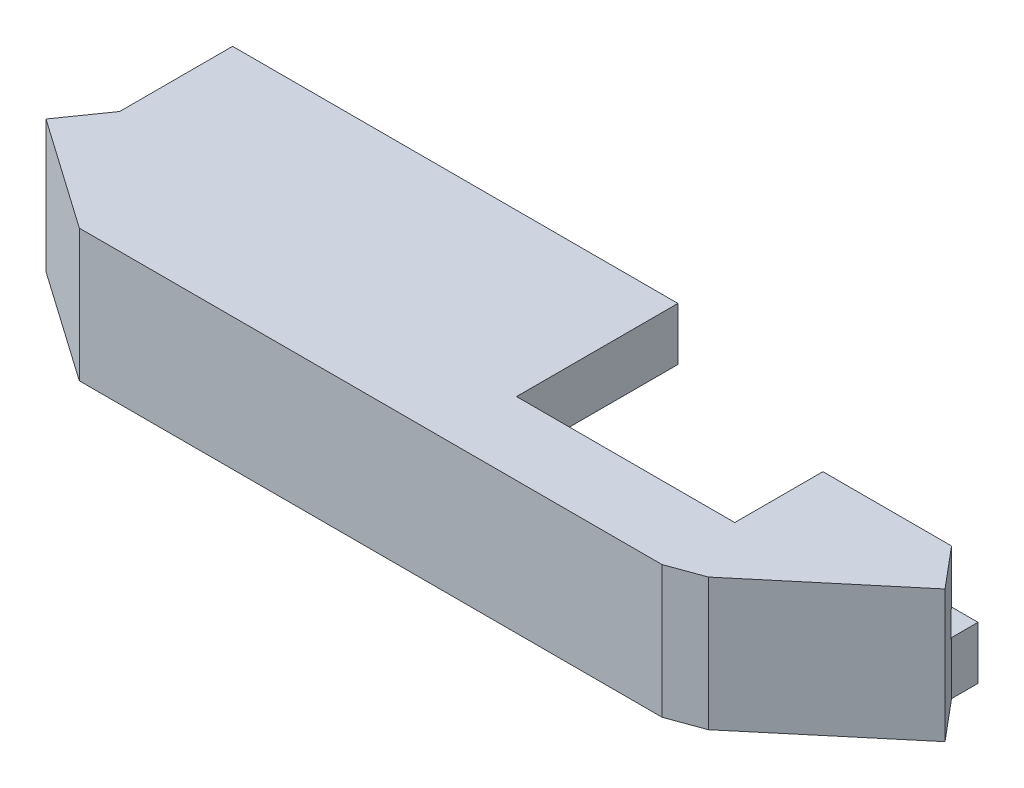
ISO-10303-21;
HEADER;
FILE_DESCRIPTION(('STEP AP214'),'2;1');
FILE_NAME('part.step','',(''),(''),'','','');
FILE_SCHEMA(('AUTOMOTIVE_DESIGN { 1 0 10303 214 1 1 1 1 }'));
ENDSEC;
DATA;
#1=APPLICATION_CONTEXT('core data for automotive mechanical design processes');
#2=APPLICATION_PROTOCOL_DEFINITION('international standard','automotive_design',2000,#1);
#3=PRODUCT_CONTEXT('',#1,'mechanical');
#4=PRODUCT('Part','Part','',(#3));
#5=PRODUCT_RELATED_PRODUCT_CATEGORY('part','',(#4));
#6=PRODUCT_DEFINITION_FORMATION('','',#4);
#7=PRODUCT_DEFINITION_CONTEXT('part definition',#1,'design');
#8=PRODUCT_DEFINITION('design','',#6,#7);
#9=PRODUCT_DEFINITION_SHAPE('','',#8);
#10=(LENGTH_UNIT() NAMED_UNIT(*) SI_UNIT(.MILLI.,.METRE.));
#11=(NAMED_UNIT(*) PLANE_ANGLE_UNIT() SI_UNIT($,.RADIAN.));
#12=(NAMED_UNIT(*) SI_UNIT($,.STERADIAN.) SOLID_ANGLE_UNIT());
#13=UNCERTAINTY_MEASURE_WITH_UNIT(LENGTH_MEASURE(1.E-05),#10,'distance_accuracy_value','');
#14=(GEOMETRIC_REPRESENTATION_CONTEXT(3) GLOBAL_UNCERTAINTY_ASSIGNED_CONTEXT((#13)) GLOBAL_UNIT_ASSIGNED_CONTEXT((#10,
#11,#12)) REPRESENTATION_CONTEXT('',''));
#15=CARTESIAN_POINT('',(0.,0.,0.));
#16=DIRECTION('',(0.,0.,1.));
#17=DIRECTION('',(1.,0.,0.));
#18=AXIS2_PLACEMENT_3D('',#15,#16,#17);
#19=CARTESIAN_POINT('',(0.,-2.,0.));
#20=DIRECTION('',(0.,-1.,0.));
#21=DIRECTION('',(0.,0.,-1.));
#22=AXIS2_PLACEMENT_3D('',#19,#20,#21);
#23=PLANE('',#22);
#24=CARTESIAN_POINT('',(13.15,-2.,0.95));
#25=DIRECTION('',(0.,1.,0.));
#26=DIRECTION('',(0.,0.,1.));
#27=AXIS2_PLACEMENT_3D('',#24,#25,#26);
#28=CIRCLE('',#27,5.15);
#29=CARTESIAN_POINT('',(12.2588159097779,-2.,-4.12230627203593));
#30=VERTEX_POINT('',#29);
#31=CARTESIAN_POINT('',(8.24118409022208,-2.,-0.607570660968924));
#32=VERTEX_POINT('',#31);
#33=EDGE_CURVE('E348',#30,#32,#28,.T.);
#34=ORIENTED_EDGE('',*,*,#33,.F.);
#35=DIRECTION('',(0.,0.,-1.));
#36=VECTOR('',#35,1.);
#37=CARTESIAN_POINT('',(12.2588159097779,-2.,-5.16218792715937));
#38=LINE('',#37,#36);
#39=CARTESIAN_POINT('',(12.2588159097779,-2.,-5.16218792715937));
#40=VERTEX_POINT('',#39);
#41=EDGE_CURVE('E271',#30,#40,#38,.T.);
#42=ORIENTED_EDGE('',*,*,#41,.T.);
#43=DIRECTION('',(1.,0.,0.));
#44=VECTOR('',#43,1.);
#45=CARTESIAN_POINT('',(0.,-2.,-5.16218792715937));
#46=LINE('',#45,#44);
#47=CARTESIAN_POINT('',(-7.37236839860096,-2.,-5.16218792715937));
#48=VERTEX_POINT('',#47);
#49=EDGE_CURVE('E320',#48,#40,#46,.T.);
#50=ORIENTED_EDGE('',*,*,#49,.F.);
#51=DIRECTION('',(-0.573576436351058,0.,0.819152044288984));
#52=VECTOR('',#51,1.);
#53=CARTESIAN_POINT('',(-7.37236839860085,-2.,-5.16218792715952));
#54=LINE('',#53,#52);
#55=CARTESIAN_POINT('',(-7.54444132950627,-2.,-4.91644231387268));
#56=VERTEX_POINT('',#55);
#57=EDGE_CURVE('E318',#48,#56,#54,.T.);
#58=ORIENTED_EDGE('',*,*,#57,.T.);
#59=DIRECTION('',(0.819152044288997,0.,0.573576436351038));
#60=VECTOR('',#59,1.);
#61=CARTESIAN_POINT('',(-0.172072930905292,-2.,0.245745613286671));
#62=LINE('',#61,#60);
#63=CARTESIAN_POINT('',(-0.0945896366636159,-2.,0.300000000000012));
#64=VERTEX_POINT('',#63);
#65=EDGE_CURVE('E356',#56,#64,#62,.T.);
#66=ORIENTED_EDGE('',*,*,#65,.T.);
#67=DIRECTION('',(1.,0.,0.));
#68=VECTOR('',#67,1.);
#69=CARTESIAN_POINT('',(0.,-2.,0.3));
#70=LINE('',#69,#68);
#71=CARTESIAN_POINT('',(8.24118409022208,-2.,0.300000000000003));
#72=VERTEX_POINT('',#71);
#73=EDGE_CURVE('E354',#64,#72,#70,.T.);
#74=ORIENTED_EDGE('',*,*,#73,.T.);
#75=DIRECTION('',(0.,0.,-1.));
#76=VECTOR('',#75,1.);
#77=CARTESIAN_POINT('',(8.24118409022208,-2.,0.));
#78=LINE('',#77,#76);
#79=EDGE_CURVE('E351',#72,#32,#78,.T.);
#80=ORIENTED_EDGE('',*,*,#79,.T.);
#81=EDGE_LOOP('',(#34,#42,#50,#58,#66,#74,#80));
#82=FACE_BOUND('',#81,.T.);
#83=ADVANCED_FACE('F45',(#82),#23,.F.);
#84=CARTESIAN_POINT('',(0.,0.,0.));
#85=DIRECTION('',(0.,1.,0.));
#86=DIRECTION('',(0.,0.,1.));
#87=AXIS2_PLACEMENT_3D('',#84,#85,#86);
#88=PLANE('',#87);
#89=DIRECTION('',(0.819152044288997,0.,0.573576436351038));
#90=VECTOR('',#89,1.);
#91=CARTESIAN_POINT('',(-0.172072930905292,0.,0.245745613286671));
#92=LINE('',#91,#90);
#93=CARTESIAN_POINT('',(-7.54444132950627,0.,-4.91644231387267));
#94=VERTEX_POINT('',#93);
#95=CARTESIAN_POINT('',(-0.0945896366636159,0.,0.300000000000012));
#96=VERTEX_POINT('',#95);
#97=EDGE_CURVE('E368',#94,#96,#92,.T.);
#98=ORIENTED_EDGE('',*,*,#97,.F.);
#99=DIRECTION('',(-0.573576436351033,0.,0.819152044289002));
#100=VECTOR('',#99,1.);
#101=CARTESIAN_POINT('',(-7.37236839860101,0.,-5.16218792715929));
#102=LINE('',#101,#100);
#103=CARTESIAN_POINT('',(-7.37236839860095,0.,-5.16218792715937));
#104=VERTEX_POINT('',#103);
#105=EDGE_CURVE('E402',#104,#94,#102,.T.);
#106=ORIENTED_EDGE('',*,*,#105,.F.);
#107=DIRECTION('',(0.,0.,-1.));
#108=VECTOR('',#107,1.);
#109=CARTESIAN_POINT('',(-7.37236839860096,0.,0.));
#110=LINE('',#109,#108);
#111=CARTESIAN_POINT('',(-7.37236839860095,0.,-13.7));
#112=VERTEX_POINT('',#111);
#113=EDGE_CURVE('E443',#104,#112,#110,.T.);
#114=ORIENTED_EDGE('',*,*,#113,.T.);
#115=DIRECTION('',(-1.,0.,0.));
#116=VECTOR('',#115,1.);
#117=CARTESIAN_POINT('',(0.,0.,-13.7));
#118=LINE('',#117,#116);
#119=CARTESIAN_POINT('',(26.3,0.,-13.7));
#120=VERTEX_POINT('',#119);
#121=EDGE_CURVE('E440',#120,#112,#118,.T.);
#122=ORIENTED_EDGE('',*,*,#121,.F.);
#123=DIRECTION('',(0.,0.,-1.));
#124=VECTOR('',#123,1.);
#125=CARTESIAN_POINT('',(26.3,0.,0.));
#126=LINE('',#125,#124);
#127=CARTESIAN_POINT('',(26.3,0.,-1.5));
#128=VERTEX_POINT('',#127);
#129=EDGE_CURVE('E438',#128,#120,#126,.T.);
#130=ORIENTED_EDGE('',*,*,#129,.F.);
#131=DIRECTION('',(-1.,0.,0.));
#132=VECTOR('',#131,1.);
#133=CARTESIAN_POINT('',(0.,0.,-1.5));
#134=LINE('',#133,#132);
#135=CARTESIAN_POINT('',(42.8,0.,-1.5));
#136=VERTEX_POINT('',#135);
#137=EDGE_CURVE('E436',#136,#128,#134,.T.);
#138=ORIENTED_EDGE('',*,*,#137,.F.);
#139=DIRECTION('',(0.,0.,-1.));
#140=VECTOR('',#139,1.);
#141=CARTESIAN_POINT('',(42.8,0.,0.));
#142=LINE('',#141,#140);
#143=CARTESIAN_POINT('',(42.8,0.,-8.16340264301906));
#144=VERTEX_POINT('',#143);
#145=EDGE_CURVE('E433',#136,#144,#142,.T.);
#146=ORIENTED_EDGE('',*,*,#145,.T.);
#147=DIRECTION('',(-1.,0.,0.));
#148=VECTOR('',#147,1.);
#149=CARTESIAN_POINT('',(0.,0.,-8.16340264301906));
#150=LINE('',#149,#148);
#151=CARTESIAN_POINT('',(52.528764427611,0.,-8.16340264301906));
#152=VERTEX_POINT('',#151);
#153=EDGE_CURVE('E430',#152,#144,#150,.T.);
#154=ORIENTED_EDGE('',*,*,#153,.F.);
#155=DIRECTION('',(0.642787609686541,0.,0.766044443118976));
#156=VECTOR('',#155,1.);
#157=CARTESIAN_POINT('',(34.8448354296832,0.,-29.2382885574803));
#158=LINE('',#157,#156);
#159=CARTESIAN_POINT('',(52.721600710517,0.,-7.93358931008336));
#160=VERTEX_POINT('',#159);
#161=EDGE_CURVE('E379',#152,#160,#158,.T.);
#162=ORIENTED_EDGE('',*,*,#161,.T.);
#163=DIRECTION('',(0.766044443118977,0.,-0.64278760968654));
#164=VECTOR('',#163,1.);
#165=CARTESIAN_POINT('',(17.8767652808337,0.,21.304699247397));
#166=LINE('',#165,#164);
#167=CARTESIAN_POINT('',(42.992836282906,0.,0.22981333293569));
#168=VERTEX_POINT('',#167);
#169=EDGE_CURVE('E370',#168,#160,#166,.T.);
#170=ORIENTED_EDGE('',*,*,#169,.F.);
#171=DIRECTION('',(0.939692620785911,0.,-0.342020143325663));
#172=VECTOR('',#171,1.);
#173=CARTESIAN_POINT('',(5.10306705870667,0.,14.0205615137596));
#174=LINE('',#173,#172);
#175=CARTESIAN_POINT('',(42.8,0.,0.3));
#176=VERTEX_POINT('',#175);
#177=EDGE_CURVE('E373',#176,#168,#174,.T.);
#178=ORIENTED_EDGE('',*,*,#177,.F.);
#179=DIRECTION('',(1.,0.,0.));
#180=VECTOR('',#179,1.);
#181=CARTESIAN_POINT('',(0.,0.,0.3));
#182=LINE('',#181,#180);
#183=CARTESIAN_POINT('',(18.0588159097779,0.,0.3));
#184=VERTEX_POINT('',#183);
#185=EDGE_CURVE('E349',#184,#176,#182,.T.);
#186=ORIENTED_EDGE('',*,*,#185,.F.);
#187=DIRECTION('',(0.,0.,-1.));
#188=VECTOR('',#187,1.);
#189=CARTESIAN_POINT('',(18.0588159097779,0.,0.));
#190=LINE('',#189,#188);
#191=CARTESIAN_POINT('',(18.0588159097779,0.,-0.607570660968912));
#192=VERTEX_POINT('',#191);
#193=EDGE_CURVE('E345',#184,#192,#190,.T.);
#194=ORIENTED_EDGE('',*,*,#193,.T.);
#195=CARTESIAN_POINT('',(13.15,0.,0.95));
#196=DIRECTION('',(0.,1.,0.));
#197=DIRECTION('',(0.,0.,1.));
#198=AXIS2_PLACEMENT_3D('',#195,#196,#197);
#199=CIRCLE('',#198,5.15);
#200=CARTESIAN_POINT('',(8.24118409022208,0.,-0.607570660968924));
#201=VERTEX_POINT('',#200);
#202=EDGE_CURVE('E249',#192,#201,#199,.T.);
#203=ORIENTED_EDGE('',*,*,#202,.T.);
#204=DIRECTION('',(0.,0.,-1.));
#205=VECTOR('',#204,1.);
#206=CARTESIAN_POINT('',(8.24118409022208,0.,0.));
#207=LINE('',#206,#205);
#208=CARTESIAN_POINT('',(8.24118409022208,0.,0.300000000000003));
#209=VERTEX_POINT('',#208);
#210=EDGE_CURVE('E364',#209,#201,#207,.T.);
#211=ORIENTED_EDGE('',*,*,#210,.F.);
#212=EDGE_CURVE('E68',#96,#209,#182,.T.);
#213=ORIENTED_EDGE('',*,*,#212,.F.);
#214=EDGE_LOOP('',(#98,#106,#114,#122,#130,#138,#146,#154,#162,#170,#178,#186,#194,#203,#211,#213));
#215=FACE_BOUND('',#214,.T.);
#216=ADVANCED_FACE('F476',(#215),#88,.F.);
#217=CARTESIAN_POINT('',(20.2550794366737,4.,24.1390636869372));
#218=DIRECTION('',(-0.642787609686537,0.,-0.76604444311898));
#219=DIRECTION('',(-0.76604444311898,0.,0.642787609686537));
#220=AXIS2_PLACEMENT_3D('',#217,#218,#219);
#221=PLANE('',#220);
#222=DIRECTION('',(0.,-1.,0.));
#223=VECTOR('',#222,1.);
#224=CARTESIAN_POINT('',(45.3711504387462,4.,3.06417777247591));
#225=LINE('',#224,#223);
#226=CARTESIAN_POINT('',(45.3711504387462,4.,3.06417777247591));
#227=VERTEX_POINT('',#226);
#228=CARTESIAN_POINT('',(45.3711504387462,-6.,3.06417777247592));
#229=VERTEX_POINT('',#228);
#230=EDGE_CURVE('E428',#227,#229,#225,.T.);
#231=ORIENTED_EDGE('',*,*,#230,.T.);
#232=DIRECTION('',(0.76604444311898,0.,-0.642787609686537));
#233=VECTOR('',#232,1.);
#234=CARTESIAN_POINT('',(20.2550794366737,-6.,24.1390636869372));
#235=LINE('',#234,#233);
#236=CARTESIAN_POINT('',(55.0999148663572,-6.,-5.0992248705431));
#237=VERTEX_POINT('',#236);
#238=EDGE_CURVE('E286',#229,#237,#235,.T.);
#239=ORIENTED_EDGE('',*,*,#238,.T.);
#240=DIRECTION('',(0.,-1.,0.));
#241=VECTOR('',#240,1.);
#242=CARTESIAN_POINT('',(55.0999148663572,4.,-5.0992248705431));
#243=LINE('',#242,#241);
#244=CARTESIAN_POINT('',(55.0999148663572,4.,-5.0992248705431));
#245=VERTEX_POINT('',#244);
#246=EDGE_CURVE('E11',#245,#237,#243,.T.);
#247=ORIENTED_EDGE('',*,*,#246,.F.);
#248=DIRECTION('',(0.76604444311898,0.,-0.642787609686537));
#249=VECTOR('',#248,1.);
#250=CARTESIAN_POINT('',(20.2550794366737,4.,24.1390636869372));
#251=LINE('',#250,#249);
#252=EDGE_CURVE('E399',#227,#245,#251,.T.);
#253=ORIENTED_EDGE('',*,*,#252,.F.);
#254=EDGE_LOOP('',(#231,#239,#247,#253));
#255=FACE_BOUND('',#254,.T.);
#256=ADVANCED_FACE('F47',(#255),#221,.F.);
#257=CARTESIAN_POINT('',(34.8448354296832,4.,-29.2382885574803));
#258=DIRECTION('',(0.766044443118976,0.,-0.642787609686541));
#259=DIRECTION('',(-0.642787609686541,0.,-0.766044443118976));
#260=AXIS2_PLACEMENT_3D('',#257,#258,#259);
#261=PLANE('',#260);
#262=ORIENTED_EDGE('',*,*,#161,.F.);
#263=DIRECTION('',(0.,-1.,0.));
#264=VECTOR('',#263,1.);
#265=CARTESIAN_POINT('',(52.528764427611,4.,-8.16340264301906));
#266=LINE('',#265,#264);
#267=CARTESIAN_POINT('',(52.528764427611,4.,-8.16340264301906));
#268=VERTEX_POINT('',#267);
#269=EDGE_CURVE('E53',#268,#152,#266,.T.);
#270=ORIENTED_EDGE('',*,*,#269,.F.);
#271=DIRECTION('',(0.642787609686541,0.,0.766044443118976));
#272=VECTOR('',#271,1.);
#273=CARTESIAN_POINT('',(34.8448354296832,4.,-29.2382885574803));
#274=LINE('',#273,#272);
#275=EDGE_CURVE('E401',#268,#245,#274,.T.);
#276=ORIENTED_EDGE('',*,*,#275,.T.);
#277=ORIENTED_EDGE('',*,*,#246,.T.);
#278=DIRECTION('',(0.642787609686538,0.,0.76604444311898));
#279=VECTOR('',#278,1.);
#280=CARTESIAN_POINT('',(34.8448354296835,-6.,-29.2382885574803));
#281=LINE('',#280,#279);
#282=CARTESIAN_POINT('',(52.528764427611,-6.,-8.16340264301906));
#283=VERTEX_POINT('',#282);
#284=EDGE_CURVE('E282',#283,#237,#281,.T.);
#285=ORIENTED_EDGE('',*,*,#284,.F.);
#286=DIRECTION('',(0.,1.,0.));
#287=VECTOR('',#286,1.);
#288=CARTESIAN_POINT('',(52.528764427611,-6.,-8.16340264301906));
#289=LINE('',#288,#287);
#290=CARTESIAN_POINT('',(52.528764427611,-2.,-8.16340264301906));
#291=VERTEX_POINT('',#290);
#292=EDGE_CURVE('E343',#283,#291,#289,.T.);
#293=ORIENTED_EDGE('',*,*,#292,.T.);
#294=DIRECTION('',(0.642787609686538,0.,0.76604444311898));
#295=VECTOR('',#294,1.);
#296=CARTESIAN_POINT('',(34.8448354296835,-2.,-29.2382885574803));
#297=LINE('',#296,#295);
#298=CARTESIAN_POINT('',(52.721600710517,-2.,-7.93358931008337));
#299=VERTEX_POINT('',#298);
#300=EDGE_CURVE('E315',#291,#299,#297,.T.);
#301=ORIENTED_EDGE('',*,*,#300,.T.);
#302=DIRECTION('',(0.,1.,0.));
#303=VECTOR('',#302,1.);
#304=CARTESIAN_POINT('',(52.721600710517,-2.,-7.93358931008336));
#305=LINE('',#304,#303);
#306=EDGE_CURVE('E386',#299,#160,#305,.T.);
#307=ORIENTED_EDGE('',*,*,#306,.T.);
#308=EDGE_LOOP('',(#262,#270,#276,#277,#285,#293,#301,#307));
#309=FACE_BOUND('',#308,.T.);
#310=ADVANCED_FACE('F479',(#309),#261,.T.);
#311=CARTESIAN_POINT('',(0.,4.,-8.16340264301906));
#312=DIRECTION('',(0.,0.,1.));
#313=DIRECTION('',(1.,0.,0.));
#314=AXIS2_PLACEMENT_3D('',#311,#312,#313);
#315=PLANE('',#314);
#316=ORIENTED_EDGE('',*,*,#153,.T.);
#317=DIRECTION('',(0.,-1.,0.));
#318=VECTOR('',#317,1.);
#319=CARTESIAN_POINT('',(42.8,4.,-8.16340264301906));
#320=LINE('',#319,#318);
#321=CARTESIAN_POINT('',(42.8,4.,-8.16340264301906));
#322=VERTEX_POINT('',#321);
#323=EDGE_CURVE('E467',#322,#144,#320,.T.);
#324=ORIENTED_EDGE('',*,*,#323,.F.);
#325=DIRECTION('',(-1.,0.,0.));
#326=VECTOR('',#325,1.);
#327=CARTESIAN_POINT('',(0.,4.,-8.16340264301906));
#328=LINE('',#327,#326);
#329=EDGE_CURVE('E405',#268,#322,#328,.T.);
#330=ORIENTED_EDGE('',*,*,#329,.F.);
#331=ORIENTED_EDGE('',*,*,#269,.T.);
#332=EDGE_LOOP('',(#316,#324,#330,#331));
#333=FACE_BOUND('',#332,.T.);
#334=ADVANCED_FACE('F471',(#333),#315,.F.);
#335=CARTESIAN_POINT('',(42.8,4.,0.));
#336=DIRECTION('',(-1.,0.,0.));
#337=DIRECTION('',(0.,0.,1.));
#338=AXIS2_PLACEMENT_3D('',#335,#336,#337);
#339=PLANE('',#338);
#340=ORIENTED_EDGE('',*,*,#145,.F.);
#341=DIRECTION('',(0.,-1.,0.));
#342=VECTOR('',#341,1.);
#343=CARTESIAN_POINT('',(42.8,4.,-1.5));
#344=LINE('',#343,#342);
#345=CARTESIAN_POINT('',(42.8,4.,-1.5));
#346=VERTEX_POINT('',#345);
#347=EDGE_CURVE('E465',#346,#136,#344,.T.);
#348=ORIENTED_EDGE('',*,*,#347,.F.);
#349=DIRECTION('',(0.,0.,-1.));
#350=VECTOR('',#349,1.);
#351=CARTESIAN_POINT('',(42.8,4.,0.));
#352=LINE('',#351,#350);
#353=EDGE_CURVE('E407',#346,#322,#352,.T.);
#354=ORIENTED_EDGE('',*,*,#353,.T.);
#355=ORIENTED_EDGE('',*,*,#323,.T.);
#356=EDGE_LOOP('',(#340,#348,#354,#355));
#357=FACE_BOUND('',#356,.T.);
#358=ADVANCED_FACE('F581',(#357),#339,.T.);
#359=CARTESIAN_POINT('',(0.,4.,-1.5));
#360=DIRECTION('',(0.,0.,1.));
#361=DIRECTION('',(1.,0.,0.));
#362=AXIS2_PLACEMENT_3D('',#359,#360,#361);
#363=PLANE('',#362);
#364=ORIENTED_EDGE('',*,*,#137,.T.);
#365=DIRECTION('',(0.,-1.,0.));
#366=VECTOR('',#365,1.);
#367=CARTESIAN_POINT('',(26.3,4.,-1.5));
#368=LINE('',#367,#366);
#369=CARTESIAN_POINT('',(26.3,4.,-1.5));
#370=VERTEX_POINT('',#369);
#371=EDGE_CURVE('E462',#370,#128,#368,.T.);
#372=ORIENTED_EDGE('',*,*,#371,.F.);
#373=DIRECTION('',(-1.,0.,0.));
#374=VECTOR('',#373,1.);
#375=CARTESIAN_POINT('',(0.,4.,-1.5));
#376=LINE('',#375,#374);
#377=EDGE_CURVE('E410',#346,#370,#376,.T.);
#378=ORIENTED_EDGE('',*,*,#377,.F.);
#379=ORIENTED_EDGE('',*,*,#347,.T.);
#380=EDGE_LOOP('',(#364,#372,#378,#379));
#381=FACE_BOUND('',#380,.T.);
#382=ADVANCED_FACE('F578',(#381),#363,.F.);
#383=CARTESIAN_POINT('',(26.3,4.,0.));
#384=DIRECTION('',(-1.,0.,0.));
#385=DIRECTION('',(0.,0.,1.));
#386=AXIS2_PLACEMENT_3D('',#383,#384,#385);
#387=PLANE('',#386);
#388=ORIENTED_EDGE('',*,*,#129,.T.);
#389=DIRECTION('',(0.,-1.,0.));
#390=VECTOR('',#389,1.);
#391=CARTESIAN_POINT('',(26.3,4.,-13.7));
#392=LINE('',#391,#390);
#393=CARTESIAN_POINT('',(26.3,4.,-13.7));
#394=VERTEX_POINT('',#393);
#395=EDGE_CURVE('E459',#394,#120,#392,.T.);
#396=ORIENTED_EDGE('',*,*,#395,.F.);
#397=DIRECTION('',(0.,0.,-1.));
#398=VECTOR('',#397,1.);
#399=CARTESIAN_POINT('',(26.3,4.,0.));
#400=LINE('',#399,#398);
#401=EDGE_CURVE('E412',#370,#394,#400,.T.);
#402=ORIENTED_EDGE('',*,*,#401,.F.);
#403=ORIENTED_EDGE('',*,*,#371,.T.);
#404=EDGE_LOOP('',(#388,#396,#402,#403));
#405=FACE_BOUND('',#404,.T.);
#406=ADVANCED_FACE('F574',(#405),#387,.F.);
#407=CARTESIAN_POINT('',(0.,4.,-13.7));
#408=DIRECTION('',(0.,0.,1.));
#409=DIRECTION('',(1.,0.,0.));
#410=AXIS2_PLACEMENT_3D('',#407,#408,#409);
#411=PLANE('',#410);
#412=ORIENTED_EDGE('',*,*,#121,.T.);
#413=DIRECTION('',(0.,-1.,0.));
#414=VECTOR('',#413,1.);
#415=CARTESIAN_POINT('',(-7.37236839860095,4.,-13.7));
#416=LINE('',#415,#414);
#417=CARTESIAN_POINT('',(-7.37236839860095,4.,-13.7));
#418=VERTEX_POINT('',#417);
#419=EDGE_CURVE('E457',#418,#112,#416,.T.);
#420=ORIENTED_EDGE('',*,*,#419,.F.);
#421=DIRECTION('',(-1.,0.,0.));
#422=VECTOR('',#421,1.);
#423=CARTESIAN_POINT('',(0.,4.,-13.7));
#424=LINE('',#423,#422);
#425=EDGE_CURVE('E414',#394,#418,#424,.T.);
#426=ORIENTED_EDGE('',*,*,#425,.F.);
#427=ORIENTED_EDGE('',*,*,#395,.T.);
#428=EDGE_LOOP('',(#412,#420,#426,#427));
#429=FACE_BOUND('',#428,.T.);
#430=ADVANCED_FACE('F569',(#429),#411,.F.);
#431=CARTESIAN_POINT('',(-7.37236839860096,4.,0.));
#432=DIRECTION('',(-1.,0.,0.));
#433=DIRECTION('',(0.,0.,1.));
#434=AXIS2_PLACEMENT_3D('',#431,#432,#433);
#435=PLANE('',#434);
#436=ORIENTED_EDGE('',*,*,#113,.F.);
#437=DIRECTION('',(0.,-1.,0.));
#438=VECTOR('',#437,1.);
#439=CARTESIAN_POINT('',(-7.37236839860095,4.,-5.16218792715937));
#440=LINE('',#439,#438);
#441=CARTESIAN_POINT('',(-7.37236839860095,4.,-5.16218792715937));
#442=VERTEX_POINT('',#441);
#443=EDGE_CURVE('E455',#442,#104,#440,.T.);
#444=ORIENTED_EDGE('',*,*,#443,.F.);
#445=DIRECTION('',(0.,0.,-1.));
#446=VECTOR('',#445,1.);
#447=CARTESIAN_POINT('',(-7.37236839860096,4.,0.));
#448=LINE('',#447,#446);
#449=EDGE_CURVE('E416',#442,#418,#448,.T.);
#450=ORIENTED_EDGE('',*,*,#449,.T.);
#451=ORIENTED_EDGE('',*,*,#419,.T.);
#452=EDGE_LOOP('',(#436,#444,#450,#451));
#453=FACE_BOUND('',#452,.T.);
#454=ADVANCED_FACE('F564',(#453),#435,.T.);
#455=CARTESIAN_POINT('',(-7.37236839860101,4.,-5.16218792715929));
#456=DIRECTION('',(0.819152044289001,0.,0.573576436351032));
#457=DIRECTION('',(0.573576436351032,0.,-0.819152044289002));
#458=AXIS2_PLACEMENT_3D('',#455,#456,#457);
#459=PLANE('',#458);
#460=ORIENTED_EDGE('',*,*,#105,.T.);
#461=DIRECTION('',(0.,1.,0.));
#462=VECTOR('',#461,1.);
#463=CARTESIAN_POINT('',(-7.54444132950626,-2.,-4.91644231387267));
#464=LINE('',#463,#462);
#465=EDGE_CURVE('E389',#56,#94,#464,.T.);
#466=ORIENTED_EDGE('',*,*,#465,.F.);
#467=ORIENTED_EDGE('',*,*,#57,.F.);
#468=DIRECTION('',(0.,1.,0.));
#469=VECTOR('',#468,1.);
#470=CARTESIAN_POINT('',(-7.37236839860096,-6.,-5.16218792715937));
#471=LINE('',#470,#469);
#472=CARTESIAN_POINT('',(-7.37236839860096,-6.,-5.16218792715937));
#473=VERTEX_POINT('',#472);
#474=EDGE_CURVE('E341',#473,#48,#471,.T.);
#475=ORIENTED_EDGE('',*,*,#474,.F.);
#476=DIRECTION('',(-0.573576436351058,0.,0.819152044288984));
#477=VECTOR('',#476,1.);
#478=CARTESIAN_POINT('',(-7.37236839860085,-6.,-5.16218792715952));
#479=LINE('',#478,#477);
#480=CARTESIAN_POINT('',(-9.66667414400513,-6.,-1.88557975000338));
#481=VERTEX_POINT('',#480);
#482=EDGE_CURVE('E298',#473,#481,#479,.T.);
#483=ORIENTED_EDGE('',*,*,#482,.T.);
#484=DIRECTION('',(0.,-1.,0.));
#485=VECTOR('',#484,1.);
#486=CARTESIAN_POINT('',(-9.66667414400511,4.,-1.88557975000338));
#487=LINE('',#486,#485);
#488=CARTESIAN_POINT('',(-9.66667414400511,4.,-1.88557975000338));
#489=VERTEX_POINT('',#488);
#490=EDGE_CURVE('E453',#489,#481,#487,.T.);
#491=ORIENTED_EDGE('',*,*,#490,.F.);
#492=DIRECTION('',(-0.573576436351033,0.,0.819152044289002));
#493=VECTOR('',#492,1.);
#494=CARTESIAN_POINT('',(-7.37236839860101,4.,-5.16218792715929));
#495=LINE('',#494,#493);
#496=EDGE_CURVE('E419',#442,#489,#495,.T.);
#497=ORIENTED_EDGE('',*,*,#496,.F.);
#498=ORIENTED_EDGE('',*,*,#443,.T.);
#499=EDGE_LOOP('',(#460,#466,#467,#475,#483,#491,#497,#498));
#500=FACE_BOUND('',#499,.T.);
#501=ADVANCED_FACE('F537',(#500),#459,.F.);
#502=CARTESIAN_POINT('',(-2.29430574540413,4.,3.27660817715596));
#503=DIRECTION('',(0.573576436351038,0.,-0.819152044288997));
#504=DIRECTION('',(-0.819152044288997,0.,-0.573576436351038));
#505=AXIS2_PLACEMENT_3D('',#502,#503,#504);
#506=PLANE('',#505);
#507=ORIENTED_EDGE('',*,*,#490,.T.);
#508=DIRECTION('',(0.819152044288997,0.,0.573576436351038));
#509=VECTOR('',#508,1.);
#510=CARTESIAN_POINT('',(-2.29430574540414,-6.,3.27660817715597));
#511=LINE('',#510,#509);
#512=CARTESIAN_POINT('',(-1.26119515551587,-6.,4.));
#513=VERTEX_POINT('',#512);
#514=EDGE_CURVE('E295',#481,#513,#511,.T.);
#515=ORIENTED_EDGE('',*,*,#514,.T.);
#516=DIRECTION('',(0.,-1.,0.));
#517=VECTOR('',#516,1.);
#518=CARTESIAN_POINT('',(-1.26119515551585,4.,4.));
#519=LINE('',#518,#517);
#520=CARTESIAN_POINT('',(-1.26119515551585,4.,4.));
#521=VERTEX_POINT('',#520);
#522=EDGE_CURVE('E451',#521,#513,#519,.T.);
#523=ORIENTED_EDGE('',*,*,#522,.F.);
#524=DIRECTION('',(0.819152044288997,0.,0.573576436351038));
#525=VECTOR('',#524,1.);
#526=CARTESIAN_POINT('',(-2.29430574540413,4.,3.27660817715596));
#527=LINE('',#526,#525);
#528=EDGE_CURVE('E421',#489,#521,#527,.T.);
#529=ORIENTED_EDGE('',*,*,#528,.F.);
#530=EDGE_LOOP('',(#507,#515,#523,#529));
#531=FACE_BOUND('',#530,.T.);
#532=ADVANCED_FACE('F532',(#531),#506,.F.);
#533=CARTESIAN_POINT('',(0.,4.,4.));
#534=DIRECTION('',(0.,0.,1.));
#535=DIRECTION('',(1.,0.,0.));
#536=AXIS2_PLACEMENT_3D('',#533,#534,#535);
#537=PLANE('',#536);
#538=ORIENTED_EDGE('',*,*,#522,.T.);
#539=DIRECTION('',(-1.,0.,0.));
#540=VECTOR('',#539,1.);
#541=CARTESIAN_POINT('',(0.,-6.,4.));
#542=LINE('',#541,#540);
#543=CARTESIAN_POINT('',(42.8,-6.,4.));
#544=VERTEX_POINT('',#543);
#545=EDGE_CURVE('E292',#544,#513,#542,.T.);
#546=ORIENTED_EDGE('',*,*,#545,.F.);
#547=DIRECTION('',(0.,-1.,0.));
#548=VECTOR('',#547,1.);
#549=CARTESIAN_POINT('',(42.8,4.,4.));
#550=LINE('',#549,#548);
#551=CARTESIAN_POINT('',(42.8,4.,4.));
#552=VERTEX_POINT('',#551);
#553=EDGE_CURVE('E449',#552,#544,#550,.T.);
#554=ORIENTED_EDGE('',*,*,#553,.F.);
#555=DIRECTION('',(-1.,0.,0.));
#556=VECTOR('',#555,1.);
#557=CARTESIAN_POINT('',(0.,4.,4.));
#558=LINE('',#557,#556);
#559=EDGE_CURVE('E423',#552,#521,#558,.T.);
#560=ORIENTED_EDGE('',*,*,#559,.T.);
#561=EDGE_LOOP('',(#538,#546,#554,#560));
#562=FACE_BOUND('',#561,.T.);
#563=ADVANCED_FACE('F584',(#562),#537,.T.);
#564=CARTESIAN_POINT('',(6.29222413662691,4.,17.2877437335299));
#565=DIRECTION('',(-0.342020143325668,0.,-0.939692620785909));
#566=DIRECTION('',(-0.939692620785909,0.,0.342020143325668));
#567=AXIS2_PLACEMENT_3D('',#564,#565,#566);
#568=PLANE('',#567);
#569=ORIENTED_EDGE('',*,*,#553,.T.);
#570=DIRECTION('',(0.939692620785909,0.,-0.342020143325667));
#571=VECTOR('',#570,1.);
#572=CARTESIAN_POINT('',(6.2922241366269,-6.,17.2877437335299));
#573=LINE('',#572,#571);
#574=EDGE_CURVE('E289',#544,#229,#573,.T.);
#575=ORIENTED_EDGE('',*,*,#574,.T.);
#576=ORIENTED_EDGE('',*,*,#230,.F.);
#577=DIRECTION('',(0.939692620785909,0.,-0.342020143325668));
#578=VECTOR('',#577,1.);
#579=CARTESIAN_POINT('',(6.29222413662691,4.,17.2877437335299));
#580=LINE('',#579,#578);
#581=EDGE_CURVE('E426',#552,#227,#580,.T.);
#582=ORIENTED_EDGE('',*,*,#581,.F.);
#583=EDGE_LOOP('',(#569,#575,#576,#582));
#584=FACE_BOUND('',#583,.T.);
#585=ADVANCED_FACE('F524',(#584),#568,.F.);
#586=CARTESIAN_POINT('',(0.,4.,0.));
#587=DIRECTION('',(0.,1.,0.));
#588=DIRECTION('',(0.,0.,1.));
#589=AXIS2_PLACEMENT_3D('',#586,#587,#588);
#590=PLANE('',#589);
#591=ORIENTED_EDGE('',*,*,#252,.T.);
#592=ORIENTED_EDGE('',*,*,#275,.F.);
#593=ORIENTED_EDGE('',*,*,#329,.T.);
#594=ORIENTED_EDGE('',*,*,#353,.F.);
#595=ORIENTED_EDGE('',*,*,#377,.T.);
#596=ORIENTED_EDGE('',*,*,#401,.T.);
#597=ORIENTED_EDGE('',*,*,#425,.T.);
#598=ORIENTED_EDGE('',*,*,#449,.F.);
#599=ORIENTED_EDGE('',*,*,#496,.T.);
#600=ORIENTED_EDGE('',*,*,#528,.T.);
#601=ORIENTED_EDGE('',*,*,#559,.F.);
#602=ORIENTED_EDGE('',*,*,#581,.T.);
#603=EDGE_LOOP('',(#591,#592,#593,#594,#595,#596,#597,#598,#599,#600,#601,#602));
#604=FACE_BOUND('',#603,.T.);
#605=ADVANCED_FACE('F583',(#604),#590,.T.);
#606=CARTESIAN_POINT('',(18.0588159097779,-2.,0.));
#607=DIRECTION('',(1.,0.,0.));
#608=DIRECTION('',(0.,0.,-1.));
#609=AXIS2_PLACEMENT_3D('',#606,#607,#608);
#610=PLANE('',#609);
#611=ORIENTED_EDGE('',*,*,#193,.F.);
#612=DIRECTION('',(0.,1.,0.));
#613=VECTOR('',#612,1.);
#614=CARTESIAN_POINT('',(18.0588159097779,-2.,0.3));
#615=LINE('',#614,#613);
#616=CARTESIAN_POINT('',(18.0588159097779,-2.,0.3));
#617=VERTEX_POINT('',#616);
#618=EDGE_CURVE('E376',#617,#184,#615,.T.);
#619=ORIENTED_EDGE('',*,*,#618,.F.);
#620=DIRECTION('',(0.,0.,-1.));
#621=VECTOR('',#620,1.);
#622=CARTESIAN_POINT('',(18.0588159097779,-2.,0.));
#623=LINE('',#622,#621);
#624=CARTESIAN_POINT('',(18.0588159097779,-2.,0.));
#625=VERTEX_POINT('',#624);
#626=EDGE_CURVE('E346',#617,#625,#623,.T.);
#627=ORIENTED_EDGE('',*,*,#626,.T.);
#628=DIRECTION('',(0.,-1.,0.));
#629=VECTOR('',#628,1.);
#630=CARTESIAN_POINT('',(18.0588159097779,-2.,0.));
#631=LINE('',#630,#629);
#632=CARTESIAN_POINT('',(18.0588159097779,-6.,0.));
#633=VERTEX_POINT('',#632);
#634=EDGE_CURVE('E259',#625,#633,#631,.T.);
#635=ORIENTED_EDGE('',*,*,#634,.T.);
#636=DIRECTION('',(0.,0.,1.));
#637=VECTOR('',#636,1.);
#638=CARTESIAN_POINT('',(18.0588159097779,-6.,0.));
#639=LINE('',#638,#637);
#640=CARTESIAN_POINT('',(18.0588159097779,-6.,-0.607570660968916));
#641=VERTEX_POINT('',#640);
#642=EDGE_CURVE('E256',#641,#633,#639,.T.);
#643=ORIENTED_EDGE('',*,*,#642,.F.);
#644=DIRECTION('',(0.,1.,0.));
#645=VECTOR('',#644,1.);
#646=CARTESIAN_POINT('',(18.0588159097779,-2.,-0.607570660968912));
#647=LINE('',#646,#645);
#648=EDGE_CURVE('E242',#641,#192,#647,.T.);
#649=ORIENTED_EDGE('',*,*,#648,.T.);
#650=EDGE_LOOP('',(#611,#619,#627,#635,#643,#649));
#651=FACE_BOUND('',#650,.T.);
#652=ADVANCED_FACE('F257',(#651),#610,.T.);
#653=CARTESIAN_POINT('',(0.,-2.,0.3));
#654=DIRECTION('',(0.,0.,1.));
#655=DIRECTION('',(1.,0.,0.));
#656=AXIS2_PLACEMENT_3D('',#653,#654,#655);
#657=PLANE('',#656);
#658=ORIENTED_EDGE('',*,*,#185,.T.);
#659=DIRECTION('',(0.,1.,0.));
#660=VECTOR('',#659,1.);
#661=CARTESIAN_POINT('',(42.8,-2.,0.3));
#662=LINE('',#661,#660);
#663=CARTESIAN_POINT('',(42.8,-2.,0.3));
#664=VERTEX_POINT('',#663);
#665=EDGE_CURVE('E380',#664,#176,#662,.T.);
#666=ORIENTED_EDGE('',*,*,#665,.F.);
#667=EDGE_CURVE('E253',#617,#664,#70,.T.);
#668=ORIENTED_EDGE('',*,*,#667,.F.);
#669=ORIENTED_EDGE('',*,*,#618,.T.);
#670=EDGE_LOOP('',(#658,#666,#668,#669));
#671=FACE_BOUND('',#670,.T.);
#672=ADVANCED_FACE('F493',(#671),#657,.F.);
#673=CARTESIAN_POINT('',(5.10306705870667,-2.,14.0205615137596));
#674=DIRECTION('',(0.342020143325663,0.,0.939692620785911));
#675=DIRECTION('',(0.939692620785911,0.,-0.342020143325663));
#676=AXIS2_PLACEMENT_3D('',#673,#674,#675);
#677=PLANE('',#676);
#678=ORIENTED_EDGE('',*,*,#177,.T.);
#679=DIRECTION('',(0.,1.,0.));
#680=VECTOR('',#679,1.);
#681=CARTESIAN_POINT('',(42.992836282906,-2.,0.22981333293569));
#682=LINE('',#681,#680);
#683=CARTESIAN_POINT('',(42.992836282906,-2.,0.22981333293569));
#684=VERTEX_POINT('',#683);
#685=EDGE_CURVE('E383',#684,#168,#682,.T.);
#686=ORIENTED_EDGE('',*,*,#685,.F.);
#687=DIRECTION('',(0.939692620785911,0.,-0.342020143325663));
#688=VECTOR('',#687,1.);
#689=CARTESIAN_POINT('',(5.10306705870667,-2.,14.0205615137596));
#690=LINE('',#689,#688);
#691=EDGE_CURVE('E360',#664,#684,#690,.T.);
#692=ORIENTED_EDGE('',*,*,#691,.F.);
#693=ORIENTED_EDGE('',*,*,#665,.T.);
#694=EDGE_LOOP('',(#678,#686,#692,#693));
#695=FACE_BOUND('',#694,.T.);
#696=ADVANCED_FACE('F488',(#695),#677,.F.);
#697=CARTESIAN_POINT('',(17.8767652808337,-2.,21.304699247397));
#698=DIRECTION('',(0.64278760968654,0.,0.766044443118977));
#699=DIRECTION('',(0.766044443118977,0.,-0.64278760968654));
#700=AXIS2_PLACEMENT_3D('',#697,#698,#699);
#701=PLANE('',#700);
#702=ORIENTED_EDGE('',*,*,#169,.T.);
#703=ORIENTED_EDGE('',*,*,#306,.F.);
#704=DIRECTION('',(0.766044443118977,0.,-0.64278760968654));
#705=VECTOR('',#704,1.);
#706=CARTESIAN_POINT('',(17.8767652808337,-2.,21.304699247397));
#707=LINE('',#706,#705);
#708=EDGE_CURVE('E358',#684,#299,#707,.T.);
#709=ORIENTED_EDGE('',*,*,#708,.F.);
#710=ORIENTED_EDGE('',*,*,#685,.T.);
#711=EDGE_LOOP('',(#702,#703,#709,#710));
#712=FACE_BOUND('',#711,.T.);
#713=ADVANCED_FACE('F484',(#712),#701,.F.);
#714=CARTESIAN_POINT('',(-0.172072930905292,-2.,0.245745613286671));
#715=DIRECTION('',(-0.573576436351038,0.,0.819152044288997));
#716=DIRECTION('',(0.819152044288997,0.,0.573576436351038));
#717=AXIS2_PLACEMENT_3D('',#714,#715,#716);
#718=PLANE('',#717);
#719=ORIENTED_EDGE('',*,*,#97,.T.);
#720=DIRECTION('',(0.,1.,0.));
#721=VECTOR('',#720,1.);
#722=CARTESIAN_POINT('',(-0.0945896366636159,-2.,0.300000000000012));
#723=LINE('',#722,#721);
#724=EDGE_CURVE('E392',#64,#96,#723,.T.);
#725=ORIENTED_EDGE('',*,*,#724,.F.);
#726=ORIENTED_EDGE('',*,*,#65,.F.);
#727=ORIENTED_EDGE('',*,*,#465,.T.);
#728=EDGE_LOOP('',(#719,#725,#726,#727));
#729=FACE_BOUND('',#728,.T.);
#730=ADVANCED_FACE('F559',(#729),#718,.F.);
#731=ORIENTED_EDGE('',*,*,#212,.T.);
#732=DIRECTION('',(0.,1.,0.));
#733=VECTOR('',#732,1.);
#734=CARTESIAN_POINT('',(8.24118409022208,-2.,0.300000000000003));
#735=LINE('',#734,#733);
#736=EDGE_CURVE('E395',#72,#209,#735,.T.);
#737=ORIENTED_EDGE('',*,*,#736,.F.);
#738=ORIENTED_EDGE('',*,*,#73,.F.);
#739=ORIENTED_EDGE('',*,*,#724,.T.);
#740=EDGE_LOOP('',(#731,#737,#738,#739));
#741=FACE_BOUND('',#740,.T.);
#742=ADVANCED_FACE('F554',(#741),#657,.F.);
#743=CARTESIAN_POINT('',(8.24118409022208,-2.,0.));
#744=DIRECTION('',(1.,0.,0.));
#745=DIRECTION('',(0.,0.,-1.));
#746=AXIS2_PLACEMENT_3D('',#743,#744,#745);
#747=PLANE('',#746);
#748=ORIENTED_EDGE('',*,*,#210,.T.);
#749=DIRECTION('',(0.,1.,0.));
#750=VECTOR('',#749,1.);
#751=CARTESIAN_POINT('',(8.24118409022208,-2.,-0.607570660968924));
#752=LINE('',#751,#750);
#753=EDGE_CURVE('E252',#32,#201,#752,.T.);
#754=ORIENTED_EDGE('',*,*,#753,.F.);
#755=ORIENTED_EDGE('',*,*,#79,.F.);
#756=ORIENTED_EDGE('',*,*,#736,.T.);
#757=EDGE_LOOP('',(#748,#754,#755,#756));
#758=FACE_BOUND('',#757,.T.);
#759=ADVANCED_FACE('F551',(#758),#747,.F.);
#760=CARTESIAN_POINT('',(13.15,-2.,0.95));
#761=DIRECTION('',(0.,1.,0.));
#762=DIRECTION('',(0.,0.,1.));
#763=AXIS2_PLACEMENT_3D('',#760,#761,#762);
#764=CYLINDRICAL_SURFACE('',#763,5.15);
#765=ORIENTED_EDGE('',*,*,#202,.F.);
#766=ORIENTED_EDGE('',*,*,#648,.F.);
#767=CARTESIAN_POINT('',(13.15,-6.,0.95));
#768=DIRECTION('',(0.,-1.,0.));
#769=DIRECTION('',(0.,0.,-1.));
#770=AXIS2_PLACEMENT_3D('',#767,#768,#769);
#771=CIRCLE('',#770,5.15);
#772=CARTESIAN_POINT('',(12.2588159097779,-6.,-4.12230627203593));
#773=VERTEX_POINT('',#772);
#774=EDGE_CURVE('E247',#773,#641,#771,.T.);
#775=ORIENTED_EDGE('',*,*,#774,.F.);
#776=DIRECTION('',(0.,-1.,0.));
#777=VECTOR('',#776,1.);
#778=CARTESIAN_POINT('',(12.2588159097779,-2.,-4.12230627203593));
#779=LINE('',#778,#777);
#780=EDGE_CURVE('E268',#30,#773,#779,.T.);
#781=ORIENTED_EDGE('',*,*,#780,.F.);
#782=ORIENTED_EDGE('',*,*,#33,.T.);
#783=ORIENTED_EDGE('',*,*,#753,.T.);
#784=EDGE_LOOP('',(#765,#766,#775,#781,#782,#783));
#785=FACE_BOUND('',#784,.T.);
#786=ADVANCED_FACE('F244',(#785),#764,.T.);
#787=DIRECTION('',(1.,0.,0.));
#788=VECTOR('',#787,1.);
#789=CARTESIAN_POINT('',(0.,-2.,0.));
#790=LINE('',#789,#788);
#791=CARTESIAN_POINT('',(42.8,-2.,0.));
#792=VERTEX_POINT('',#791);
#793=EDGE_CURVE('E323',#625,#792,#790,.T.);
#794=ORIENTED_EDGE('',*,*,#793,.F.);
#795=ORIENTED_EDGE('',*,*,#626,.F.);
#796=ORIENTED_EDGE('',*,*,#667,.T.);
#797=ORIENTED_EDGE('',*,*,#691,.T.);
#798=ORIENTED_EDGE('',*,*,#708,.T.);
#799=ORIENTED_EDGE('',*,*,#300,.F.);
#800=DIRECTION('',(0.,0.,-1.));
#801=VECTOR('',#800,1.);
#802=CARTESIAN_POINT('',(52.528764427611,-2.,0.));
#803=LINE('',#802,#801);
#804=CARTESIAN_POINT('',(52.528764427611,-2.,-10.1634026430191));
#805=VERTEX_POINT('',#804);
#806=EDGE_CURVE('E278',#291,#805,#803,.T.);
#807=ORIENTED_EDGE('',*,*,#806,.T.);
#808=DIRECTION('',(-1.,0.,0.));
#809=VECTOR('',#808,1.);
#810=CARTESIAN_POINT('',(0.,-2.,-10.1634026430191));
#811=LINE('',#810,#809);
#812=CARTESIAN_POINT('',(44.028764427611,-2.,-10.1634026430191));
#813=VERTEX_POINT('',#812);
#814=EDGE_CURVE('E283',#805,#813,#811,.T.);
#815=ORIENTED_EDGE('',*,*,#814,.T.);
#816=DIRECTION('',(0.,0.,1.));
#817=VECTOR('',#816,1.);
#818=CARTESIAN_POINT('',(44.028764427611,-2.,0.));
#819=LINE('',#818,#817);
#820=CARTESIAN_POINT('',(44.028764427611,-2.,-1.03105577801216));
#821=VERTEX_POINT('',#820);
#822=EDGE_CURVE('E328',#813,#821,#819,.T.);
#823=ORIENTED_EDGE('',*,*,#822,.T.);
#824=DIRECTION('',(0.766044443118977,0.,-0.64278760968654));
#825=VECTOR('',#824,1.);
#826=CARTESIAN_POINT('',(17.6839289979277,-2.,21.0748859144613));
#827=LINE('',#826,#825);
#828=EDGE_CURVE('E325',#792,#821,#827,.T.);
#829=ORIENTED_EDGE('',*,*,#828,.F.);
#830=EDGE_LOOP('',(#794,#795,#796,#797,#798,#799,#807,#815,#823,#829));
#831=FACE_BOUND('',#830,.T.);
#832=ADVANCED_FACE('F497',(#831),#23,.F.);
#833=CARTESIAN_POINT('',(52.528764427611,-6.,0.));
#834=DIRECTION('',(1.,0.,0.));
#835=DIRECTION('',(0.,0.,-1.));
#836=AXIS2_PLACEMENT_3D('',#833,#834,#835);
#837=PLANE('',#836);
#838=ORIENTED_EDGE('',*,*,#806,.F.);
#839=ORIENTED_EDGE('',*,*,#292,.F.);
#840=DIRECTION('',(0.,0.,-1.));
#841=VECTOR('',#840,1.);
#842=CARTESIAN_POINT('',(52.528764427611,-6.,0.));
#843=LINE('',#842,#841);
#844=CARTESIAN_POINT('',(52.528764427611,-6.,-10.1634026430191));
#845=VERTEX_POINT('',#844);
#846=EDGE_CURVE('E279',#283,#845,#843,.T.);
#847=ORIENTED_EDGE('',*,*,#846,.T.);
#848=DIRECTION('',(0.,1.,0.));
#849=VECTOR('',#848,1.);
#850=CARTESIAN_POINT('',(52.528764427611,-6.,-10.1634026430191));
#851=LINE('',#850,#849);
#852=EDGE_CURVE('E312',#845,#805,#851,.T.);
#853=ORIENTED_EDGE('',*,*,#852,.T.);
#854=EDGE_LOOP('',(#838,#839,#847,#853));
#855=FACE_BOUND('',#854,.T.);
#856=ADVANCED_FACE('F514',(#855),#837,.T.);
#857=CARTESIAN_POINT('',(0.,-6.,-5.16218792715937));
#858=DIRECTION('',(0.,0.,1.));
#859=DIRECTION('',(1.,0.,0.));
#860=AXIS2_PLACEMENT_3D('',#857,#858,#859);
#861=PLANE('',#860);
#862=ORIENTED_EDGE('',*,*,#49,.T.);
#863=DIRECTION('',(0.,-1.,0.));
#864=VECTOR('',#863,1.);
#865=CARTESIAN_POINT('',(12.2588159097779,-2.,-5.16218792715937));
#866=LINE('',#865,#864);
#867=CARTESIAN_POINT('',(12.2588159097779,-6.,-5.16218792715937));
#868=VERTEX_POINT('',#867);
#869=EDGE_CURVE('E274',#40,#868,#866,.T.);
#870=ORIENTED_EDGE('',*,*,#869,.T.);
#871=DIRECTION('',(1.,0.,0.));
#872=VECTOR('',#871,1.);
#873=CARTESIAN_POINT('',(0.,-6.,-5.16218792715937));
#874=LINE('',#873,#872);
#875=EDGE_CURVE('E301',#473,#868,#874,.T.);
#876=ORIENTED_EDGE('',*,*,#875,.F.);
#877=ORIENTED_EDGE('',*,*,#474,.T.);
#878=EDGE_LOOP('',(#862,#870,#876,#877));
#879=FACE_BOUND('',#878,.T.);
#880=ADVANCED_FACE('F542',(#879),#861,.F.);
#881=CARTESIAN_POINT('',(0.,-6.,0.));
#882=DIRECTION('',(0.,0.,1.));
#883=DIRECTION('',(1.,0.,0.));
#884=AXIS2_PLACEMENT_3D('',#881,#882,#883);
#885=PLANE('',#884);
#886=DIRECTION('',(1.,0.,0.));
#887=VECTOR('',#886,1.);
#888=CARTESIAN_POINT('',(0.,-6.,0.));
#889=LINE('',#888,#887);
#890=CARTESIAN_POINT('',(42.8,-6.,0.));
#891=VERTEX_POINT('',#890);
#892=EDGE_CURVE('E60',#633,#891,#889,.T.);
#893=ORIENTED_EDGE('',*,*,#892,.F.);
#894=ORIENTED_EDGE('',*,*,#634,.F.);
#895=ORIENTED_EDGE('',*,*,#793,.T.);
#896=DIRECTION('',(0.,1.,0.));
#897=VECTOR('',#896,1.);
#898=CARTESIAN_POINT('',(42.8,-6.,0.));
#899=LINE('',#898,#897);
#900=EDGE_CURVE('E338',#891,#792,#899,.T.);
#901=ORIENTED_EDGE('',*,*,#900,.F.);
#902=EDGE_LOOP('',(#893,#894,#895,#901));
#903=FACE_BOUND('',#902,.T.);
#904=ADVANCED_FACE('F499',(#903),#885,.F.);
#905=CARTESIAN_POINT('',(17.6839289979277,-6.,21.0748859144613));
#906=DIRECTION('',(0.64278760968654,0.,0.766044443118977));
#907=DIRECTION('',(0.766044443118977,0.,-0.64278760968654));
#908=AXIS2_PLACEMENT_3D('',#905,#906,#907);
#909=PLANE('',#908);
#910=ORIENTED_EDGE('',*,*,#828,.T.);
#911=DIRECTION('',(0.,1.,0.));
#912=VECTOR('',#911,1.);
#913=CARTESIAN_POINT('',(44.028764427611,-6.,-1.03105577801216));
#914=LINE('',#913,#912);
#915=CARTESIAN_POINT('',(44.028764427611,-6.,-1.03105577801216));
#916=VERTEX_POINT('',#915);
#917=EDGE_CURVE('E336',#916,#821,#914,.T.);
#918=ORIENTED_EDGE('',*,*,#917,.F.);
#919=DIRECTION('',(0.766044443118977,0.,-0.64278760968654));
#920=VECTOR('',#919,1.);
#921=CARTESIAN_POINT('',(17.6839289979277,-6.,21.0748859144613));
#922=LINE('',#921,#920);
#923=EDGE_CURVE('E304',#891,#916,#922,.T.);
#924=ORIENTED_EDGE('',*,*,#923,.F.);
#925=ORIENTED_EDGE('',*,*,#900,.T.);
#926=EDGE_LOOP('',(#910,#918,#924,#925));
#927=FACE_BOUND('',#926,.T.);
#928=ADVANCED_FACE('F502',(#927),#909,.F.);
#929=CARTESIAN_POINT('',(44.028764427611,-6.,0.));
#930=DIRECTION('',(-1.,0.,0.));
#931=DIRECTION('',(0.,0.,1.));
#932=AXIS2_PLACEMENT_3D('',#929,#930,#931);
#933=PLANE('',#932);
#934=ORIENTED_EDGE('',*,*,#822,.F.);
#935=DIRECTION('',(0.,1.,0.));
#936=VECTOR('',#935,1.);
#937=CARTESIAN_POINT('',(44.028764427611,-6.,-10.1634026430191));
#938=LINE('',#937,#936);
#939=CARTESIAN_POINT('',(44.028764427611,-6.,-10.1634026430191));
#940=VERTEX_POINT('',#939);
#941=EDGE_CURVE('E334',#940,#813,#938,.T.);
#942=ORIENTED_EDGE('',*,*,#941,.F.);
#943=DIRECTION('',(0.,0.,1.));
#944=VECTOR('',#943,1.);
#945=CARTESIAN_POINT('',(44.028764427611,-6.,0.));
#946=LINE('',#945,#944);
#947=EDGE_CURVE('E306',#940,#916,#946,.T.);
#948=ORIENTED_EDGE('',*,*,#947,.T.);
#949=ORIENTED_EDGE('',*,*,#917,.T.);
#950=EDGE_LOOP('',(#934,#942,#948,#949));
#951=FACE_BOUND('',#950,.T.);
#952=ADVANCED_FACE('F680',(#951),#933,.T.);
#953=CARTESIAN_POINT('',(0.,-6.,-10.1634026430191));
#954=DIRECTION('',(0.,0.,-1.));
#955=DIRECTION('',(-1.,0.,0.));
#956=AXIS2_PLACEMENT_3D('',#953,#954,#955);
#957=PLANE('',#956);
#958=ORIENTED_EDGE('',*,*,#814,.F.);
#959=ORIENTED_EDGE('',*,*,#852,.F.);
#960=DIRECTION('',(-1.,0.,0.));
#961=VECTOR('',#960,1.);
#962=CARTESIAN_POINT('',(0.,-6.,-10.1634026430191));
#963=LINE('',#962,#961);
#964=EDGE_CURVE('E309',#845,#940,#963,.T.);
#965=ORIENTED_EDGE('',*,*,#964,.T.);
#966=ORIENTED_EDGE('',*,*,#941,.T.);
#967=EDGE_LOOP('',(#958,#959,#965,#966));
#968=FACE_BOUND('',#967,.T.);
#969=ADVANCED_FACE('F510',(#968),#957,.T.);
#970=CARTESIAN_POINT('',(0.,-6.,0.));
#971=DIRECTION('',(0.,-1.,0.));
#972=DIRECTION('',(0.,0.,-1.));
#973=AXIS2_PLACEMENT_3D('',#970,#971,#972);
#974=PLANE('',#973);
#975=ORIENTED_EDGE('',*,*,#642,.T.);
#976=ORIENTED_EDGE('',*,*,#892,.T.);
#977=ORIENTED_EDGE('',*,*,#923,.T.);
#978=ORIENTED_EDGE('',*,*,#947,.F.);
#979=ORIENTED_EDGE('',*,*,#964,.F.);
#980=ORIENTED_EDGE('',*,*,#846,.F.);
#981=ORIENTED_EDGE('',*,*,#284,.T.);
#982=ORIENTED_EDGE('',*,*,#238,.F.);
#983=ORIENTED_EDGE('',*,*,#574,.F.);
#984=ORIENTED_EDGE('',*,*,#545,.T.);
#985=ORIENTED_EDGE('',*,*,#514,.F.);
#986=ORIENTED_EDGE('',*,*,#482,.F.);
#987=ORIENTED_EDGE('',*,*,#875,.T.);
#988=DIRECTION('',(0.,0.,-1.));
#989=VECTOR('',#988,1.);
#990=CARTESIAN_POINT('',(12.2588159097779,-6.,-5.16218792715937));
#991=LINE('',#990,#989);
#992=EDGE_CURVE('E264',#773,#868,#991,.T.);
#993=ORIENTED_EDGE('',*,*,#992,.F.);
#994=ORIENTED_EDGE('',*,*,#774,.T.);
#995=EDGE_LOOP('',(#975,#976,#977,#978,#979,#980,#981,#982,#983,#984,#985,#986,#987,#993,#994));
#996=FACE_BOUND('',#995,.T.);
#997=ADVANCED_FACE('F262',(#996),#974,.T.);
#998=CARTESIAN_POINT('',(12.2588159097779,-2.,-5.16218792715937));
#999=DIRECTION('',(-1.,0.,0.));
#1000=DIRECTION('',(0.,0.,1.));
#1001=AXIS2_PLACEMENT_3D('',#998,#999,#1000);
#1002=PLANE('',#1001);
#1003=ORIENTED_EDGE('',*,*,#41,.F.);
#1004=ORIENTED_EDGE('',*,*,#780,.T.);
#1005=ORIENTED_EDGE('',*,*,#992,.T.);
#1006=ORIENTED_EDGE('',*,*,#869,.F.);
#1007=EDGE_LOOP('',(#1003,#1004,#1005,#1006));
#1008=FACE_BOUND('',#1007,.T.);
#1009=ADVANCED_FACE('F545',(#1008),#1002,.F.);
#1010=CLOSED_SHELL('',(#83,#216,#256,#310,#334,#358,#382,#406,#430,#454,#501,#532,#563,#585,
#605,#652,#672,#696,#713,#730,#742,#759,#786,#832,#856,#880,#904,#928,#952,#969,#997,#1009));
#1011=MANIFOLD_SOLID_BREP('B2',#1010);
#1012=ADVANCED_BREP_SHAPE_REPRESENTATION('',(#18,#1011),#14);
#1013=SHAPE_DEFINITION_REPRESENTATION(#9,#1012);
ENDSEC;
END-ISO-10303-21;
